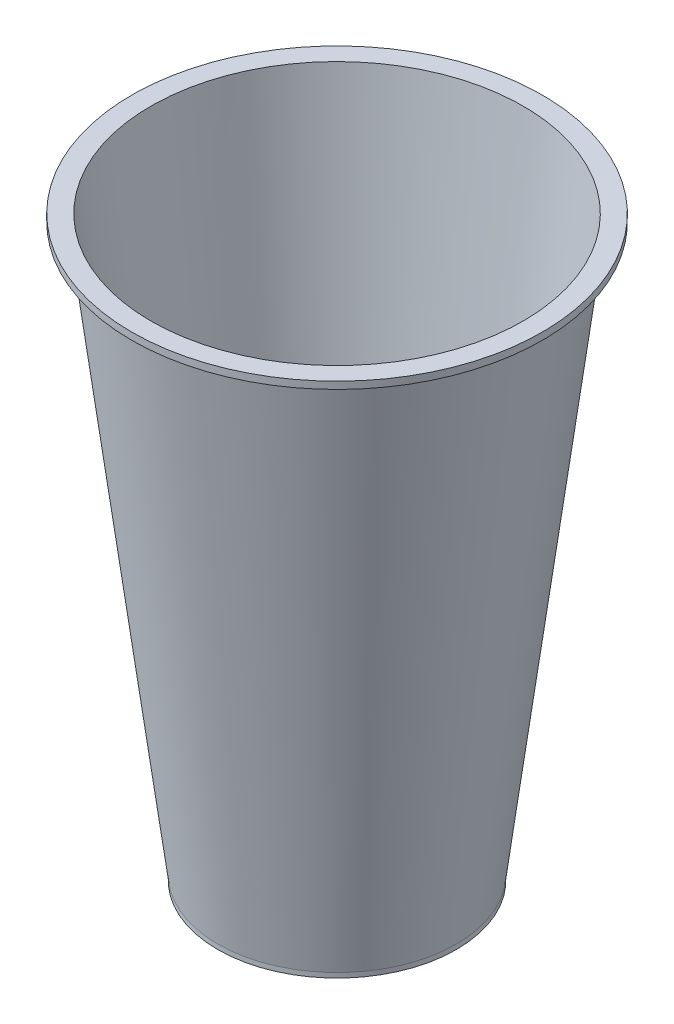
ISO-10303-21;
HEADER;
FILE_DESCRIPTION(('STEP AP214'),'2;1');
FILE_NAME('part.step','',(''),(''),'','','');
FILE_SCHEMA(('AUTOMOTIVE_DESIGN { 1 0 10303 214 1 1 1 1 }'));
ENDSEC;
DATA;
#1=APPLICATION_CONTEXT('core data for automotive mechanical design processes');
#2=APPLICATION_PROTOCOL_DEFINITION('international standard','automotive_design',2000,#1);
#3=PRODUCT_CONTEXT('',#1,'mechanical');
#4=PRODUCT('Part','Part','',(#3));
#5=PRODUCT_RELATED_PRODUCT_CATEGORY('part','',(#4));
#6=PRODUCT_DEFINITION_FORMATION('','',#4);
#7=PRODUCT_DEFINITION_CONTEXT('part definition',#1,'design');
#8=PRODUCT_DEFINITION('design','',#6,#7);
#9=PRODUCT_DEFINITION_SHAPE('','',#8);
#10=(LENGTH_UNIT() NAMED_UNIT(*) SI_UNIT(.MILLI.,.METRE.));
#11=(NAMED_UNIT(*) PLANE_ANGLE_UNIT() SI_UNIT($,.RADIAN.));
#12=(NAMED_UNIT(*) SI_UNIT($,.STERADIAN.) SOLID_ANGLE_UNIT());
#13=UNCERTAINTY_MEASURE_WITH_UNIT(LENGTH_MEASURE(1.E-05),#10,'distance_accuracy_value','');
#14=(GEOMETRIC_REPRESENTATION_CONTEXT(3) GLOBAL_UNCERTAINTY_ASSIGNED_CONTEXT((#13)) GLOBAL_UNIT_ASSIGNED_CONTEXT((#10,
#11,#12)) REPRESENTATION_CONTEXT('',''));
#15=CARTESIAN_POINT('',(0.,0.,0.));
#16=DIRECTION('',(0.,0.,1.));
#17=DIRECTION('',(1.,0.,0.));
#18=AXIS2_PLACEMENT_3D('',#15,#16,#17);
#19=CARTESIAN_POINT('',(0.,120.,0.));
#20=DIRECTION('',(0.,1.,0.));
#21=DIRECTION('',(0.,0.,1.));
#22=AXIS2_PLACEMENT_3D('',#19,#20,#21);
#23=PLANE('',#22);
#24=CARTESIAN_POINT('',(0.,120.,0.));
#25=DIRECTION('',(0.,1.,0.));
#26=DIRECTION('',(0.,0.,1.));
#27=AXIS2_PLACEMENT_3D('',#24,#25,#26);
#28=CIRCLE('',#27,38.9922177814627);
#29=CARTESIAN_POINT('',(0.,120.,38.9922177814627));
#30=VERTEX_POINT('',#29);
#31=EDGE_CURVE('E41',#30,#30,#28,.T.);
#32=ORIENTED_EDGE('',*,*,#31,.F.);
#33=EDGE_LOOP('',(#32));
#34=FACE_BOUND('',#33,.T.);
#35=CARTESIAN_POINT('',(0.,120.,0.));
#36=DIRECTION('',(0.,1.,0.));
#37=DIRECTION('',(0.,0.,1.));
#38=AXIS2_PLACEMENT_3D('',#35,#36,#37);
#39=CIRCLE('',#38,43.);
#40=CARTESIAN_POINT('',(0.,120.,43.));
#41=VERTEX_POINT('',#40);
#42=EDGE_CURVE('E93',#41,#41,#39,.T.);
#43=ORIENTED_EDGE('',*,*,#42,.T.);
#44=EDGE_LOOP('',(#43));
#45=FACE_BOUND('',#44,.T.);
#46=ADVANCED_FACE('F32',(#34,#45),#23,.T.);
#47=CARTESIAN_POINT('',(0.,0.124034734589208,0.));
#48=DIRECTION('',(0.,1.,0.));
#49=DIRECTION('',(0.,0.,1.));
#50=AXIS2_PLACEMENT_3D('',#47,#48,#49);
#51=CONICAL_SURFACE('',#50,24.0077221232863,0.124354994546761);
#52=ORIENTED_EDGE('',*,*,#31,.T.);
#53=EDGE_LOOP('',(#52));
#54=FACE_BOUND('',#53,.T.);
#55=CARTESIAN_POINT('',(0.,0.,0.));
#56=DIRECTION('',(0.,1.,0.));
#57=DIRECTION('',(0.,0.,1.));
#58=AXIS2_PLACEMENT_3D('',#55,#56,#57);
#59=CIRCLE('',#58,23.9922177814627);
#60=CARTESIAN_POINT('',(0.,0.,23.9922177814627));
#61=VERTEX_POINT('',#60);
#62=EDGE_CURVE('E11',#61,#61,#59,.T.);
#63=ORIENTED_EDGE('',*,*,#62,.F.);
#64=EDGE_LOOP('',(#63));
#65=FACE_BOUND('',#64,.T.);
#66=ADVANCED_FACE('F82',(#54,#65),#51,.F.);
#67=CARTESIAN_POINT('',(0.,0.,0.));
#68=DIRECTION('',(0.,-1.,0.));
#69=DIRECTION('',(0.,0.,-1.));
#70=AXIS2_PLACEMENT_3D('',#67,#68,#69);
#71=PLANE('',#70);
#72=ORIENTED_EDGE('',*,*,#62,.T.);
#73=EDGE_LOOP('',(#72));
#74=FACE_BOUND('',#73,.T.);
#75=ADVANCED_FACE('F80',(#74),#71,.F.);
#76=CARTESIAN_POINT('',(0.,120.,0.));
#77=DIRECTION('',(0.,1.,0.));
#78=DIRECTION('',(0.,0.,1.));
#79=AXIS2_PLACEMENT_3D('',#76,#77,#78);
#80=CYLINDRICAL_SURFACE('',#79,43.);
#81=ORIENTED_EDGE('',*,*,#42,.F.);
#82=EDGE_LOOP('',(#81));
#83=FACE_BOUND('',#82,.T.);
#84=CARTESIAN_POINT('',(0.,118.5,0.));
#85=DIRECTION('',(0.,1.,0.));
#86=DIRECTION('',(0.,0.,1.));
#87=AXIS2_PLACEMENT_3D('',#84,#85,#86);
#88=CIRCLE('',#87,43.);
#89=CARTESIAN_POINT('',(0.,118.5,43.));
#90=VERTEX_POINT('',#89);
#91=EDGE_CURVE('E95',#90,#90,#88,.T.);
#92=ORIENTED_EDGE('',*,*,#91,.T.);
#93=EDGE_LOOP('',(#92));
#94=FACE_BOUND('',#93,.T.);
#95=ADVANCED_FACE('F113',(#83,#94),#80,.T.);
#96=CARTESIAN_POINT('',(42.5,118.5,0.));
#97=DIRECTION('',(0.,1.,0.));
#98=DIRECTION('',(0.,0.,1.));
#99=AXIS2_PLACEMENT_3D('',#96,#97,#98);
#100=PLANE('',#99);
#101=ORIENTED_EDGE('',*,*,#91,.F.);
#102=EDGE_LOOP('',(#101));
#103=FACE_BOUND('',#102,.T.);
#104=CARTESIAN_POINT('',(0.,118.5,0.));
#105=DIRECTION('',(0.,1.,0.));
#106=DIRECTION('',(0.,0.,1.));
#107=AXIS2_PLACEMENT_3D('',#104,#105,#106);
#108=CIRCLE('',#107,42.5);
#109=CARTESIAN_POINT('',(0.,118.5,42.5));
#110=VERTEX_POINT('',#109);
#111=EDGE_CURVE('E98',#110,#110,#108,.T.);
#112=ORIENTED_EDGE('',*,*,#111,.T.);
#113=EDGE_LOOP('',(#112));
#114=FACE_BOUND('',#113,.T.);
#115=ADVANCED_FACE('F116',(#103,#114),#100,.F.);
#116=CARTESIAN_POINT('',(0.,120.,0.));
#117=DIRECTION('',(0.,1.,0.));
#118=DIRECTION('',(0.,0.,1.));
#119=AXIS2_PLACEMENT_3D('',#116,#117,#118);
#120=CYLINDRICAL_SURFACE('',#119,42.5);
#121=ORIENTED_EDGE('',*,*,#111,.F.);
#122=EDGE_LOOP('',(#121));
#123=FACE_BOUND('',#122,.T.);
#124=CARTESIAN_POINT('',(0.,119.5,0.));
#125=DIRECTION('',(0.,1.,0.));
#126=DIRECTION('',(0.,0.,1.));
#127=AXIS2_PLACEMENT_3D('',#124,#125,#126);
#128=CIRCLE('',#127,42.5);
#129=CARTESIAN_POINT('',(0.,119.5,42.5));
#130=VERTEX_POINT('',#129);
#131=EDGE_CURVE('E129',#130,#130,#128,.T.);
#132=ORIENTED_EDGE('',*,*,#131,.T.);
#133=EDGE_LOOP('',(#132));
#134=FACE_BOUND('',#133,.T.);
#135=ADVANCED_FACE('F109',(#123,#134),#120,.F.);
#136=CARTESIAN_POINT('',(40.,119.5,0.));
#137=DIRECTION('',(0.,1.,0.));
#138=DIRECTION('',(0.,0.,1.));
#139=AXIS2_PLACEMENT_3D('',#136,#137,#138);
#140=PLANE('',#139);
#141=ORIENTED_EDGE('',*,*,#131,.F.);
#142=EDGE_LOOP('',(#141));
#143=FACE_BOUND('',#142,.T.);
#144=CARTESIAN_POINT('',(0.,119.5,0.));
#145=DIRECTION('',(0.,1.,0.));
#146=DIRECTION('',(0.,0.,1.));
#147=AXIS2_PLACEMENT_3D('',#144,#145,#146);
#148=CIRCLE('',#147,39.9375);
#149=CARTESIAN_POINT('',(0.,119.5,39.9375));
#150=VERTEX_POINT('',#149);
#151=EDGE_CURVE('E130',#150,#150,#148,.T.);
#152=ORIENTED_EDGE('',*,*,#151,.T.);
#153=EDGE_LOOP('',(#152));
#154=FACE_BOUND('',#153,.T.);
#155=ADVANCED_FACE('F105',(#143,#154),#140,.F.);
#156=CARTESIAN_POINT('',(0.,-1.,0.));
#157=DIRECTION('',(0.,-1.,0.));
#158=DIRECTION('',(0.,0.,-1.));
#159=AXIS2_PLACEMENT_3D('',#156,#157,#158);
#160=PLANE('',#159);
#161=CARTESIAN_POINT('',(0.,-1.,0.));
#162=DIRECTION('',(0.,-1.,0.));
#163=DIRECTION('',(0.,0.,-1.));
#164=AXIS2_PLACEMENT_3D('',#161,#162,#163);
#165=CIRCLE('',#164,25.);
#166=CARTESIAN_POINT('',(0.,-1.,-25.));
#167=VERTEX_POINT('',#166);
#168=EDGE_CURVE('E46',#167,#167,#165,.T.);
#169=ORIENTED_EDGE('',*,*,#168,.T.);
#170=EDGE_LOOP('',(#169));
#171=FACE_BOUND('',#170,.T.);
#172=ADVANCED_FACE('F78',(#171),#160,.T.);
#173=CARTESIAN_POINT('',(0.,-1.,0.));
#174=DIRECTION('',(0.,1.,0.));
#175=DIRECTION('',(0.,0.,1.));
#176=AXIS2_PLACEMENT_3D('',#173,#174,#175);
#177=CYLINDRICAL_SURFACE('',#176,25.);
#178=ORIENTED_EDGE('',*,*,#168,.F.);
#179=EDGE_LOOP('',(#178));
#180=FACE_BOUND('',#179,.T.);
#181=CARTESIAN_POINT('',(0.,0.,0.));
#182=DIRECTION('',(0.,-1.,0.));
#183=DIRECTION('',(0.,0.,-1.));
#184=AXIS2_PLACEMENT_3D('',#181,#182,#183);
#185=CIRCLE('',#184,25.);
#186=CARTESIAN_POINT('',(0.,0.,-25.));
#187=VERTEX_POINT('',#186);
#188=EDGE_CURVE('E54',#187,#187,#185,.T.);
#189=ORIENTED_EDGE('',*,*,#188,.T.);
#190=EDGE_LOOP('',(#189));
#191=FACE_BOUND('',#190,.T.);
#192=ADVANCED_FACE('F68',(#180,#191),#177,.T.);
#193=CARTESIAN_POINT('',(0.,0.,0.));
#194=DIRECTION('',(0.,1.,0.));
#195=DIRECTION('',(0.,0.,1.));
#196=AXIS2_PLACEMENT_3D('',#193,#194,#195);
#197=CONICAL_SURFACE('',#196,25.,0.124354994546761);
#198=ORIENTED_EDGE('',*,*,#188,.F.);
#199=EDGE_LOOP('',(#198));
#200=FACE_BOUND('',#199,.T.);
#201=ORIENTED_EDGE('',*,*,#151,.F.);
#202=EDGE_LOOP('',(#201));
#203=FACE_BOUND('',#202,.T.);
#204=ADVANCED_FACE('F34',(#200,#203),#197,.T.);
#205=CLOSED_SHELL('',(#46,#66,#75,#95,#115,#135,#155,#172,#192,#204));
#206=MANIFOLD_SOLID_BREP('B2',#205);
#207=ADVANCED_BREP_SHAPE_REPRESENTATION('',(#18,#206),#14);
#208=SHAPE_DEFINITION_REPRESENTATION(#9,#207);
ENDSEC;
END-ISO-10303-21;
